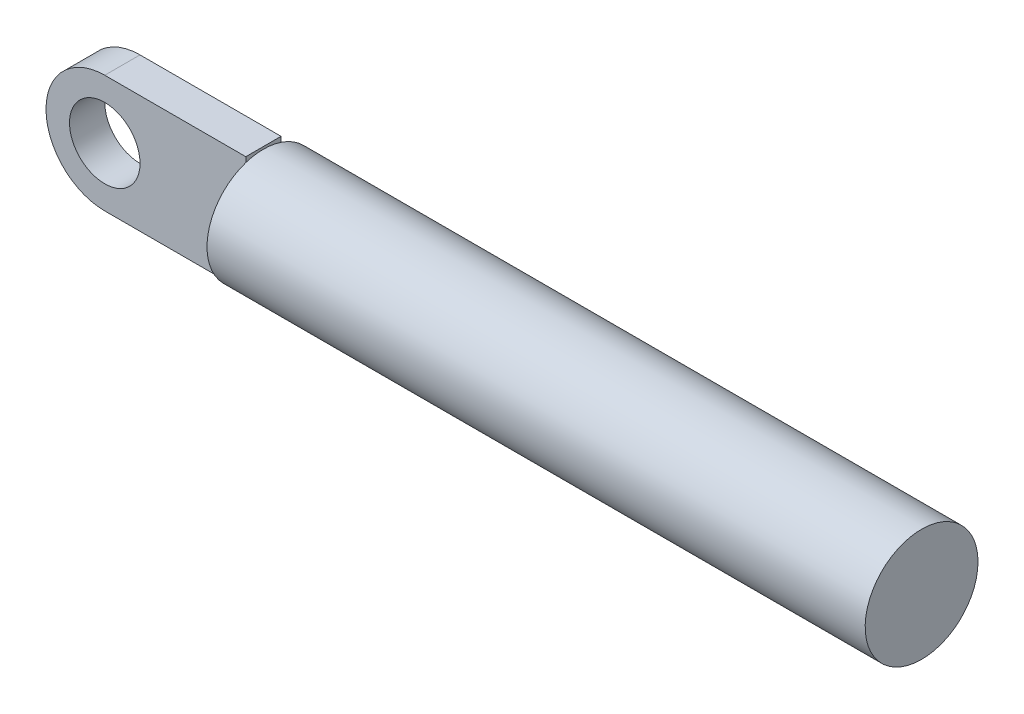
ISO-10303-21;
HEADER;
FILE_DESCRIPTION(('STEP AP214'),'2;1');
FILE_NAME('part.step','',(''),(''),'','','');
FILE_SCHEMA(('AUTOMOTIVE_DESIGN { 1 0 10303 214 1 1 1 1 }'));
ENDSEC;
DATA;
#1=APPLICATION_CONTEXT('core data for automotive mechanical design processes');
#2=APPLICATION_PROTOCOL_DEFINITION('international standard','automotive_design',2000,#1);
#3=PRODUCT_CONTEXT('',#1,'mechanical');
#4=PRODUCT('Part','Part','',(#3));
#5=PRODUCT_RELATED_PRODUCT_CATEGORY('part','',(#4));
#6=PRODUCT_DEFINITION_FORMATION('','',#4);
#7=PRODUCT_DEFINITION_CONTEXT('part definition',#1,'design');
#8=PRODUCT_DEFINITION('design','',#6,#7);
#9=PRODUCT_DEFINITION_SHAPE('','',#8);
#10=(LENGTH_UNIT() NAMED_UNIT(*) SI_UNIT(.MILLI.,.METRE.));
#11=(NAMED_UNIT(*) PLANE_ANGLE_UNIT() SI_UNIT($,.RADIAN.));
#12=(NAMED_UNIT(*) SI_UNIT($,.STERADIAN.) SOLID_ANGLE_UNIT());
#13=UNCERTAINTY_MEASURE_WITH_UNIT(LENGTH_MEASURE(1.E-05),#10,'distance_accuracy_value','');
#14=(GEOMETRIC_REPRESENTATION_CONTEXT(3) GLOBAL_UNCERTAINTY_ASSIGNED_CONTEXT((#13)) GLOBAL_UNIT_ASSIGNED_CONTEXT((#10,
#11,#12)) REPRESENTATION_CONTEXT('',''));
#15=CARTESIAN_POINT('',(0.,0.,0.));
#16=DIRECTION('',(0.,0.,1.));
#17=DIRECTION('',(1.,0.,0.));
#18=AXIS2_PLACEMENT_3D('',#15,#16,#17);
#19=CARTESIAN_POINT('',(36.,15.,9.));
#20=DIRECTION('',(-1.,0.,0.));
#21=DIRECTION('',(0.,0.,1.));
#22=AXIS2_PLACEMENT_3D('',#19,#20,#21);
#23=PLANE('',#22);
#24=CARTESIAN_POINT('',(36.,0.,4.5));
#25=DIRECTION('',(1.,0.,0.));
#26=DIRECTION('',(0.,0.,-1.));
#27=AXIS2_PLACEMENT_3D('',#24,#25,#26);
#28=CIRCLE('',#27,14.4);
#29=CARTESIAN_POINT('',(36.,13.6788157382136,0.));
#30=VERTEX_POINT('',#29);
#31=CARTESIAN_POINT('',(36.,13.6788157382136,9.));
#32=VERTEX_POINT('',#31);
#33=EDGE_CURVE('E47',#30,#32,#28,.T.);
#34=ORIENTED_EDGE('',*,*,#33,.F.);
#35=DIRECTION('',(0.,1.,0.));
#36=VECTOR('',#35,1.);
#37=CARTESIAN_POINT('',(36.,15.,0.));
#38=LINE('',#37,#36);
#39=CARTESIAN_POINT('',(36.,15.,0.));
#40=VERTEX_POINT('',#39);
#41=EDGE_CURVE('E105',#30,#40,#38,.T.);
#42=ORIENTED_EDGE('',*,*,#41,.T.);
#43=DIRECTION('',(0.,0.,-1.));
#44=VECTOR('',#43,1.);
#45=CARTESIAN_POINT('',(36.,15.,9.));
#46=LINE('',#45,#44);
#47=CARTESIAN_POINT('',(36.,15.,9.));
#48=VERTEX_POINT('',#47);
#49=EDGE_CURVE('E149',#48,#40,#46,.T.);
#50=ORIENTED_EDGE('',*,*,#49,.F.);
#51=DIRECTION('',(0.,1.,0.));
#52=VECTOR('',#51,1.);
#53=CARTESIAN_POINT('',(36.,15.,9.));
#54=LINE('',#53,#52);
#55=EDGE_CURVE('E60',#32,#48,#54,.T.);
#56=ORIENTED_EDGE('',*,*,#55,.F.);
#57=EDGE_LOOP('',(#34,#42,#50,#56));
#58=FACE_BOUND('',#57,.T.);
#59=ADVANCED_FACE('F39',(#58),#23,.F.);
#60=CARTESIAN_POINT('',(36.,-13.6788157382136,9.));
#61=VERTEX_POINT('',#60);
#62=CARTESIAN_POINT('',(36.,-13.6788157382136,0.));
#63=VERTEX_POINT('',#62);
#64=EDGE_CURVE('E11',#61,#63,#28,.T.);
#65=ORIENTED_EDGE('',*,*,#64,.F.);
#66=CARTESIAN_POINT('',(36.,-15.,9.));
#67=VERTEX_POINT('',#66);
#68=EDGE_CURVE('E138',#67,#61,#54,.T.);
#69=ORIENTED_EDGE('',*,*,#68,.F.);
#70=DIRECTION('',(0.,0.,-1.));
#71=VECTOR('',#70,1.);
#72=CARTESIAN_POINT('',(36.,-15.,9.));
#73=LINE('',#72,#71);
#74=CARTESIAN_POINT('',(36.,-15.,0.));
#75=VERTEX_POINT('',#74);
#76=EDGE_CURVE('E100',#67,#75,#73,.T.);
#77=ORIENTED_EDGE('',*,*,#76,.T.);
#78=EDGE_CURVE('E91',#75,#63,#38,.T.);
#79=ORIENTED_EDGE('',*,*,#78,.T.);
#80=EDGE_LOOP('',(#65,#69,#77,#79));
#81=FACE_BOUND('',#80,.T.);
#82=ADVANCED_FACE('F92',(#81),#23,.F.);
#83=CARTESIAN_POINT('',(0.,0.,9.));
#84=DIRECTION('',(0.,0.,1.));
#85=DIRECTION('',(1.,0.,0.));
#86=AXIS2_PLACEMENT_3D('',#83,#84,#85);
#87=PLANE('',#86);
#88=CARTESIAN_POINT('',(0.,0.,9.));
#89=DIRECTION('',(0.,0.,1.));
#90=DIRECTION('',(1.,0.,0.));
#91=AXIS2_PLACEMENT_3D('',#88,#89,#90);
#92=CIRCLE('',#91,15.);
#93=CARTESIAN_POINT('',(0.,15.,9.));
#94=VERTEX_POINT('',#93);
#95=CARTESIAN_POINT('',(0.,-15.,9.));
#96=VERTEX_POINT('',#95);
#97=EDGE_CURVE('E133',#94,#96,#92,.T.);
#98=ORIENTED_EDGE('',*,*,#97,.T.);
#99=DIRECTION('',(1.,0.,0.));
#100=VECTOR('',#99,1.);
#101=CARTESIAN_POINT('',(36.,-15.,9.));
#102=LINE('',#101,#100);
#103=EDGE_CURVE('E135',#96,#67,#102,.T.);
#104=ORIENTED_EDGE('',*,*,#103,.T.);
#105=ORIENTED_EDGE('',*,*,#68,.T.);
#106=EDGE_CURVE('E137',#61,#32,#54,.T.);
#107=ORIENTED_EDGE('',*,*,#106,.T.);
#108=ORIENTED_EDGE('',*,*,#55,.T.);
#109=DIRECTION('',(-1.,0.,0.));
#110=VECTOR('',#109,1.);
#111=CARTESIAN_POINT('',(0.,15.,9.));
#112=LINE('',#111,#110);
#113=EDGE_CURVE('E136',#48,#94,#112,.T.);
#114=ORIENTED_EDGE('',*,*,#113,.T.);
#115=EDGE_LOOP('',(#98,#104,#105,#107,#108,#114));
#116=FACE_BOUND('',#115,.T.);
#117=CARTESIAN_POINT('',(0.,0.,9.));
#118=DIRECTION('',(0.,0.,1.));
#119=DIRECTION('',(1.,0.,0.));
#120=AXIS2_PLACEMENT_3D('',#117,#118,#119);
#121=CIRCLE('',#120,9.);
#122=CARTESIAN_POINT('',(9.,0.,9.));
#123=VERTEX_POINT('',#122);
#124=EDGE_CURVE('E122',#123,#123,#121,.T.);
#125=ORIENTED_EDGE('',*,*,#124,.F.);
#126=EDGE_LOOP('',(#125));
#127=FACE_BOUND('',#126,.T.);
#128=ADVANCED_FACE('F167',(#116,#127),#87,.T.);
#129=CARTESIAN_POINT('',(0.,0.,0.));
#130=DIRECTION('',(0.,0.,1.));
#131=DIRECTION('',(1.,0.,0.));
#132=AXIS2_PLACEMENT_3D('',#129,#130,#131);
#133=PLANE('',#132);
#134=CARTESIAN_POINT('',(0.,0.,0.));
#135=DIRECTION('',(0.,0.,1.));
#136=DIRECTION('',(1.,0.,0.));
#137=AXIS2_PLACEMENT_3D('',#134,#135,#136);
#138=CIRCLE('',#137,15.);
#139=CARTESIAN_POINT('',(0.,15.,0.));
#140=VERTEX_POINT('',#139);
#141=CARTESIAN_POINT('',(0.,-15.,0.));
#142=VERTEX_POINT('',#141);
#143=EDGE_CURVE('E130',#140,#142,#138,.T.);
#144=ORIENTED_EDGE('',*,*,#143,.F.);
#145=DIRECTION('',(-1.,0.,0.));
#146=VECTOR('',#145,1.);
#147=CARTESIAN_POINT('',(0.,15.,0.));
#148=LINE('',#147,#146);
#149=EDGE_CURVE('E97',#40,#140,#148,.T.);
#150=ORIENTED_EDGE('',*,*,#149,.F.);
#151=ORIENTED_EDGE('',*,*,#41,.F.);
#152=EDGE_CURVE('E99',#63,#30,#38,.T.);
#153=ORIENTED_EDGE('',*,*,#152,.F.);
#154=ORIENTED_EDGE('',*,*,#78,.F.);
#155=DIRECTION('',(1.,0.,0.));
#156=VECTOR('',#155,1.);
#157=CARTESIAN_POINT('',(36.,-15.,0.));
#158=LINE('',#157,#156);
#159=EDGE_CURVE('E145',#142,#75,#158,.T.);
#160=ORIENTED_EDGE('',*,*,#159,.F.);
#161=EDGE_LOOP('',(#144,#150,#151,#153,#154,#160));
#162=FACE_BOUND('',#161,.T.);
#163=CARTESIAN_POINT('',(0.,0.,0.));
#164=DIRECTION('',(0.,0.,1.));
#165=DIRECTION('',(1.,0.,0.));
#166=AXIS2_PLACEMENT_3D('',#163,#164,#165);
#167=CIRCLE('',#166,9.);
#168=CARTESIAN_POINT('',(9.,0.,0.));
#169=VERTEX_POINT('',#168);
#170=EDGE_CURVE('E126',#169,#169,#167,.T.);
#171=ORIENTED_EDGE('',*,*,#170,.T.);
#172=EDGE_LOOP('',(#171));
#173=FACE_BOUND('',#172,.T.);
#174=ADVANCED_FACE('F110',(#162,#173),#133,.F.);
#175=CARTESIAN_POINT('',(0.,0.,9.));
#176=DIRECTION('',(0.,0.,-1.));
#177=DIRECTION('',(-1.,0.,0.));
#178=AXIS2_PLACEMENT_3D('',#175,#176,#177);
#179=CYLINDRICAL_SURFACE('',#178,15.);
#180=ORIENTED_EDGE('',*,*,#143,.T.);
#181=DIRECTION('',(0.,0.,-1.));
#182=VECTOR('',#181,1.);
#183=CARTESIAN_POINT('',(0.,-15.,9.));
#184=LINE('',#183,#182);
#185=EDGE_CURVE('E43',#96,#142,#184,.T.);
#186=ORIENTED_EDGE('',*,*,#185,.F.);
#187=ORIENTED_EDGE('',*,*,#97,.F.);
#188=DIRECTION('',(0.,0.,-1.));
#189=VECTOR('',#188,1.);
#190=CARTESIAN_POINT('',(0.,15.,9.));
#191=LINE('',#190,#189);
#192=EDGE_CURVE('E143',#94,#140,#191,.T.);
#193=ORIENTED_EDGE('',*,*,#192,.T.);
#194=EDGE_LOOP('',(#180,#186,#187,#193));
#195=FACE_BOUND('',#194,.T.);
#196=ADVANCED_FACE('F41',(#195),#179,.T.);
#197=CARTESIAN_POINT('',(36.,-15.,9.));
#198=DIRECTION('',(0.,1.,0.));
#199=DIRECTION('',(-1.,0.,0.));
#200=AXIS2_PLACEMENT_3D('',#197,#198,#199);
#201=PLANE('',#200);
#202=ORIENTED_EDGE('',*,*,#159,.T.);
#203=ORIENTED_EDGE('',*,*,#76,.F.);
#204=ORIENTED_EDGE('',*,*,#103,.F.);
#205=ORIENTED_EDGE('',*,*,#185,.T.);
#206=EDGE_LOOP('',(#202,#203,#204,#205));
#207=FACE_BOUND('',#206,.T.);
#208=ADVANCED_FACE('F152',(#207),#201,.F.);
#209=CARTESIAN_POINT('',(0.,15.,9.));
#210=DIRECTION('',(0.,-1.,0.));
#211=DIRECTION('',(1.,0.,0.));
#212=AXIS2_PLACEMENT_3D('',#209,#210,#211);
#213=PLANE('',#212);
#214=ORIENTED_EDGE('',*,*,#149,.T.);
#215=ORIENTED_EDGE('',*,*,#192,.F.);
#216=ORIENTED_EDGE('',*,*,#113,.F.);
#217=ORIENTED_EDGE('',*,*,#49,.T.);
#218=EDGE_LOOP('',(#214,#215,#216,#217));
#219=FACE_BOUND('',#218,.T.);
#220=ADVANCED_FACE('F157',(#219),#213,.F.);
#221=CARTESIAN_POINT('',(0.,0.,9.));
#222=DIRECTION('',(0.,0.,-1.));
#223=DIRECTION('',(-1.,0.,0.));
#224=AXIS2_PLACEMENT_3D('',#221,#222,#223);
#225=CYLINDRICAL_SURFACE('',#224,9.);
#226=ORIENTED_EDGE('',*,*,#124,.T.);
#227=EDGE_LOOP('',(#226));
#228=FACE_BOUND('',#227,.T.);
#229=ORIENTED_EDGE('',*,*,#170,.F.);
#230=EDGE_LOOP('',(#229));
#231=FACE_BOUND('',#230,.T.);
#232=ADVANCED_FACE('F175',(#228,#231),#225,.F.);
#233=CARTESIAN_POINT('',(36.,0.,4.5));
#234=DIRECTION('',(1.,0.,0.));
#235=DIRECTION('',(0.,0.,-1.));
#236=AXIS2_PLACEMENT_3D('',#233,#234,#235);
#237=PLANE('',#236);
#238=EDGE_CURVE('E115',#63,#30,#28,.T.);
#239=ORIENTED_EDGE('',*,*,#238,.F.);
#240=ORIENTED_EDGE('',*,*,#152,.T.);
#241=EDGE_LOOP('',(#239,#240));
#242=FACE_BOUND('',#241,.T.);
#243=ADVANCED_FACE('F114',(#242),#237,.F.);
#244=CARTESIAN_POINT('',(204.,0.,4.5));
#245=DIRECTION('',(-1.,0.,0.));
#246=DIRECTION('',(0.,0.,1.));
#247=AXIS2_PLACEMENT_3D('',#244,#245,#246);
#248=CYLINDRICAL_SURFACE('',#247,14.4);
#249=CARTESIAN_POINT('',(204.,0.,4.5));
#250=DIRECTION('',(1.,0.,0.));
#251=DIRECTION('',(0.,0.,-1.));
#252=AXIS2_PLACEMENT_3D('',#249,#250,#251);
#253=CIRCLE('',#252,14.4);
#254=CARTESIAN_POINT('',(204.,0.,-9.9));
#255=VERTEX_POINT('',#254);
#256=EDGE_CURVE('E123',#255,#255,#253,.T.);
#257=ORIENTED_EDGE('',*,*,#256,.F.);
#258=EDGE_LOOP('',(#257));
#259=FACE_BOUND('',#258,.T.);
#260=ORIENTED_EDGE('',*,*,#33,.T.);
#261=EDGE_CURVE('E49',#32,#61,#28,.T.);
#262=ORIENTED_EDGE('',*,*,#261,.T.);
#263=ORIENTED_EDGE('',*,*,#64,.T.);
#264=ORIENTED_EDGE('',*,*,#238,.T.);
#265=EDGE_LOOP('',(#260,#262,#263,#264));
#266=FACE_BOUND('',#265,.T.);
#267=ADVANCED_FACE('F119',(#259,#266),#248,.T.);
#268=CARTESIAN_POINT('',(204.,0.,4.5));
#269=DIRECTION('',(1.,0.,0.));
#270=DIRECTION('',(0.,0.,-1.));
#271=AXIS2_PLACEMENT_3D('',#268,#269,#270);
#272=PLANE('',#271);
#273=ORIENTED_EDGE('',*,*,#256,.T.);
#274=EDGE_LOOP('',(#273));
#275=FACE_BOUND('',#274,.T.);
#276=ADVANCED_FACE('F190',(#275),#272,.T.);
#277=ORIENTED_EDGE('',*,*,#106,.F.);
#278=ORIENTED_EDGE('',*,*,#261,.F.);
#279=EDGE_LOOP('',(#277,#278));
#280=FACE_BOUND('',#279,.T.);
#281=ADVANCED_FACE('F193',(#280),#237,.F.);
#282=CLOSED_SHELL('',(#59,#82,#128,#174,#196,#208,#220,#232,#243,#267,#276,#281));
#283=MANIFOLD_SOLID_BREP('B2',#282);
#284=ADVANCED_BREP_SHAPE_REPRESENTATION('',(#18,#283),#14);
#285=SHAPE_DEFINITION_REPRESENTATION(#9,#284);
ENDSEC;
END-ISO-10303-21;
